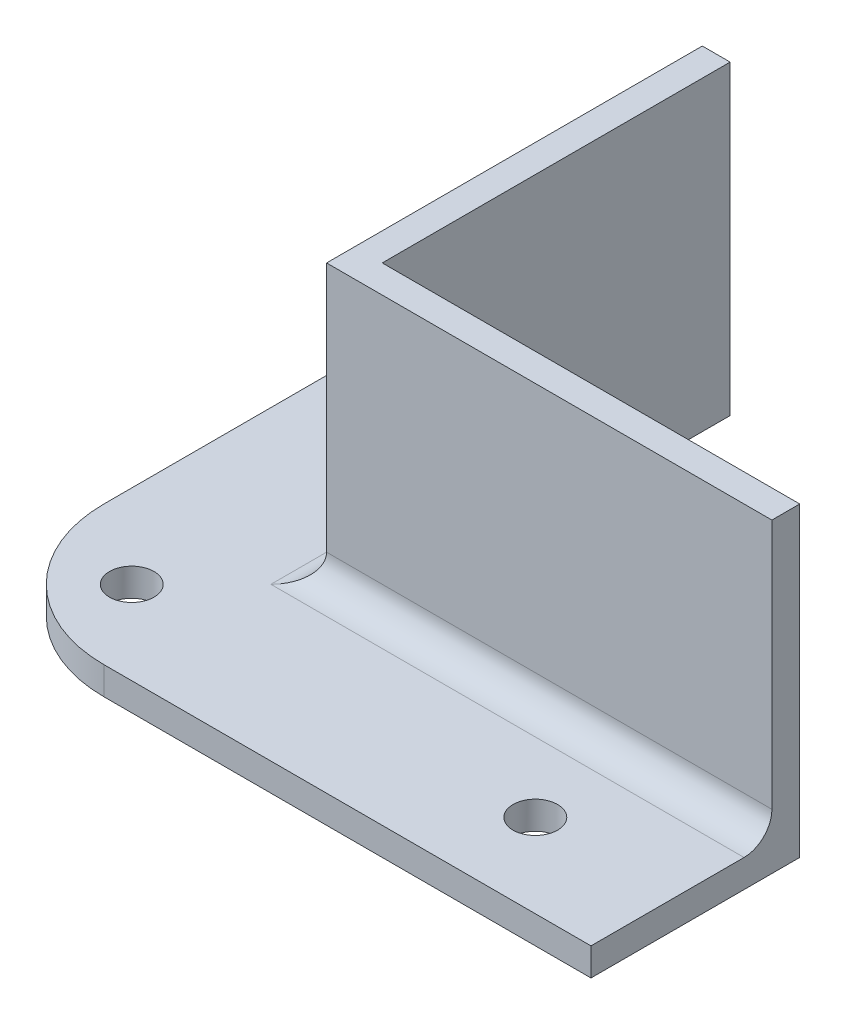
ISO-10303-21;
HEADER;
FILE_DESCRIPTION(('STEP AP214'),'2;1');
FILE_NAME('part.step','',(''),(''),'','','');
FILE_SCHEMA(('AUTOMOTIVE_DESIGN { 1 0 10303 214 1 1 1 1 }'));
ENDSEC;
DATA;
#1=APPLICATION_CONTEXT('core data for automotive mechanical design processes');
#2=APPLICATION_PROTOCOL_DEFINITION('international standard','automotive_design',2000,#1);
#3=PRODUCT_CONTEXT('',#1,'mechanical');
#4=PRODUCT('Part','Part','',(#3));
#5=PRODUCT_RELATED_PRODUCT_CATEGORY('part','',(#4));
#6=PRODUCT_DEFINITION_FORMATION('','',#4);
#7=PRODUCT_DEFINITION_CONTEXT('part definition',#1,'design');
#8=PRODUCT_DEFINITION('design','',#6,#7);
#9=PRODUCT_DEFINITION_SHAPE('','',#8);
#10=(LENGTH_UNIT() NAMED_UNIT(*) SI_UNIT(.MILLI.,.METRE.));
#11=(NAMED_UNIT(*) PLANE_ANGLE_UNIT() SI_UNIT($,.RADIAN.));
#12=(NAMED_UNIT(*) SI_UNIT($,.STERADIAN.) SOLID_ANGLE_UNIT());
#13=UNCERTAINTY_MEASURE_WITH_UNIT(LENGTH_MEASURE(1.E-05),#10,'distance_accuracy_value','');
#14=(GEOMETRIC_REPRESENTATION_CONTEXT(3) GLOBAL_UNCERTAINTY_ASSIGNED_CONTEXT((#13)) GLOBAL_UNIT_ASSIGNED_CONTEXT((#10,
#11,#12)) REPRESENTATION_CONTEXT('',''));
#15=CARTESIAN_POINT('',(0.,0.,0.));
#16=DIRECTION('',(0.,0.,1.));
#17=DIRECTION('',(1.,0.,0.));
#18=AXIS2_PLACEMENT_3D('',#15,#16,#17);
#19=CARTESIAN_POINT('',(0.,2.,0.));
#20=DIRECTION('',(0.,-1.,0.));
#21=DIRECTION('',(0.,0.,-1.));
#22=AXIS2_PLACEMENT_3D('',#19,#20,#21);
#23=PLANE('',#22);
#24=CARTESIAN_POINT('',(-17.9292929292929,2.,-15.));
#25=DIRECTION('',(0.,1.,0.));
#26=DIRECTION('',(0.,0.,1.));
#27=AXIS2_PLACEMENT_3D('',#24,#25,#26);
#28=CIRCLE('',#27,1.6);
#29=CARTESIAN_POINT('',(-17.9292929292929,2.,-13.4));
#30=VERTEX_POINT('',#29);
#31=EDGE_CURVE('E261',#30,#30,#28,.T.);
#32=ORIENTED_EDGE('',*,*,#31,.F.);
#33=EDGE_LOOP('',(#32));
#34=FACE_BOUND('',#33,.T.);
#35=CARTESIAN_POINT('',(11.0707070707071,2.,9.));
#36=DIRECTION('',(0.,1.,0.));
#37=DIRECTION('',(0.,0.,1.));
#38=AXIS2_PLACEMENT_3D('',#35,#36,#37);
#39=CIRCLE('',#38,1.6);
#40=CARTESIAN_POINT('',(11.0707070707071,2.,10.6));
#41=VERTEX_POINT('',#40);
#42=EDGE_CURVE('E468',#41,#41,#39,.T.);
#43=ORIENTED_EDGE('',*,*,#42,.F.);
#44=EDGE_LOOP('',(#43));
#45=FACE_BOUND('',#44,.T.);
#46=CARTESIAN_POINT('',(-17.9292929292929,2.,9.));
#47=DIRECTION('',(0.,1.,0.));
#48=DIRECTION('',(0.,0.,1.));
#49=AXIS2_PLACEMENT_3D('',#46,#47,#48);
#50=CIRCLE('',#49,1.6);
#51=CARTESIAN_POINT('',(-17.9292929292929,2.,10.6));
#52=VERTEX_POINT('',#51);
#53=EDGE_CURVE('E164',#52,#52,#50,.T.);
#54=ORIENTED_EDGE('',*,*,#53,.F.);
#55=EDGE_LOOP('',(#54));
#56=FACE_BOUND('',#55,.T.);
#57=DIRECTION('',(0.,0.,1.));
#58=VECTOR('',#57,1.);
#59=CARTESIAN_POINT('',(-23.9292929292929,2.,15.));
#60=LINE('',#59,#58);
#61=CARTESIAN_POINT('',(-23.9292929292929,2.,-25.));
#62=VERTEX_POINT('',#61);
#63=CARTESIAN_POINT('',(-23.9292929292929,2.,5.00000000000001));
#64=VERTEX_POINT('',#63);
#65=EDGE_CURVE('E188',#62,#64,#60,.T.);
#66=ORIENTED_EDGE('',*,*,#65,.T.);
#67=CARTESIAN_POINT('',(-13.9292929292929,2.,5.00000000000001));
#68=DIRECTION('',(0.,-1.,0.));
#69=DIRECTION('',(0.,0.,-1.));
#70=AXIS2_PLACEMENT_3D('',#67,#68,#69);
#71=CIRCLE('',#70,10.);
#72=CARTESIAN_POINT('',(-13.9292929292929,2.,15.));
#73=VERTEX_POINT('',#72);
#74=EDGE_CURVE('E11',#64,#73,#71,.F.);
#75=ORIENTED_EDGE('',*,*,#74,.T.);
#76=DIRECTION('',(1.,0.,0.));
#77=VECTOR('',#76,1.);
#78=CARTESIAN_POINT('',(21.0707070707071,2.,15.));
#79=LINE('',#78,#77);
#80=CARTESIAN_POINT('',(21.0707070707071,2.,15.));
#81=VERTEX_POINT('',#80);
#82=EDGE_CURVE('E191',#73,#81,#79,.T.);
#83=ORIENTED_EDGE('',*,*,#82,.T.);
#84=DIRECTION('',(0.,0.,-1.));
#85=VECTOR('',#84,1.);
#86=CARTESIAN_POINT('',(21.0707070707071,2.,0.));
#87=LINE('',#86,#85);
#88=CARTESIAN_POINT('',(21.0707070707071,2.,4.));
#89=VERTEX_POINT('',#88);
#90=EDGE_CURVE('E195',#81,#89,#87,.T.);
#91=ORIENTED_EDGE('',*,*,#90,.T.);
#92=DIRECTION('',(1.,0.,0.));
#93=VECTOR('',#92,1.);
#94=CARTESIAN_POINT('',(-10.9292929292929,2.,4.));
#95=LINE('',#94,#93);
#96=CARTESIAN_POINT('',(-12.9292929292929,2.,4.));
#97=VERTEX_POINT('',#96);
#98=EDGE_CURVE('E237',#89,#97,#95,.F.);
#99=ORIENTED_EDGE('',*,*,#98,.T.);
#100=DIRECTION('',(0.,0.,1.));
#101=VECTOR('',#100,1.);
#102=CARTESIAN_POINT('',(-12.9292929292929,2.,-25.));
#103=LINE('',#102,#101);
#104=CARTESIAN_POINT('',(-12.9292929292929,2.,-25.));
#105=VERTEX_POINT('',#104);
#106=EDGE_CURVE('E234',#97,#105,#103,.F.);
#107=ORIENTED_EDGE('',*,*,#106,.T.);
#108=DIRECTION('',(-1.,0.,0.));
#109=VECTOR('',#108,1.);
#110=CARTESIAN_POINT('',(-23.9292929292929,2.,-25.));
#111=LINE('',#110,#109);
#112=EDGE_CURVE('E199',#105,#62,#111,.T.);
#113=ORIENTED_EDGE('',*,*,#112,.T.);
#114=EDGE_LOOP('',(#66,#75,#83,#91,#99,#107,#113));
#115=FACE_BOUND('',#114,.T.);
#116=ADVANCED_FACE('F39',(#34,#45,#56,#115),#23,.F.);
#117=CARTESIAN_POINT('',(-23.9292929292929,2.,15.));
#118=DIRECTION('',(1.,0.,0.));
#119=DIRECTION('',(0.,0.,-1.));
#120=AXIS2_PLACEMENT_3D('',#117,#118,#119);
#121=PLANE('',#120);
#122=DIRECTION('',(0.,0.,1.));
#123=VECTOR('',#122,1.);
#124=CARTESIAN_POINT('',(-23.9292929292929,0.,15.));
#125=LINE('',#124,#123);
#126=CARTESIAN_POINT('',(-23.9292929292929,0.,-25.));
#127=VERTEX_POINT('',#126);
#128=CARTESIAN_POINT('',(-23.9292929292929,0.,5.00000000000001));
#129=VERTEX_POINT('',#128);
#130=EDGE_CURVE('E187',#127,#129,#125,.T.);
#131=ORIENTED_EDGE('',*,*,#130,.T.);
#132=DIRECTION('',(0.,-1.,0.));
#133=VECTOR('',#132,1.);
#134=CARTESIAN_POINT('',(-23.9292929292929,2.,5.00000000000001));
#135=LINE('',#134,#133);
#136=EDGE_CURVE('E49',#129,#64,#135,.F.);
#137=ORIENTED_EDGE('',*,*,#136,.T.);
#138=ORIENTED_EDGE('',*,*,#65,.F.);
#139=DIRECTION('',(0.,-1.,0.));
#140=VECTOR('',#139,1.);
#141=CARTESIAN_POINT('',(-23.9292929292929,2.,-25.));
#142=LINE('',#141,#140);
#143=EDGE_CURVE('E140',#62,#127,#142,.T.);
#144=ORIENTED_EDGE('',*,*,#143,.T.);
#145=EDGE_LOOP('',(#131,#137,#138,#144));
#146=FACE_BOUND('',#145,.T.);
#147=ADVANCED_FACE('F303',(#146),#121,.F.);
#148=CARTESIAN_POINT('',(21.0707070707071,2.,15.));
#149=DIRECTION('',(0.,0.,-1.));
#150=DIRECTION('',(-1.,0.,0.));
#151=AXIS2_PLACEMENT_3D('',#148,#149,#150);
#152=PLANE('',#151);
#153=ORIENTED_EDGE('',*,*,#82,.F.);
#154=DIRECTION('',(0.,-1.,0.));
#155=VECTOR('',#154,1.);
#156=CARTESIAN_POINT('',(-13.9292929292929,2.,15.));
#157=LINE('',#156,#155);
#158=CARTESIAN_POINT('',(-13.9292929292929,0.,15.));
#159=VERTEX_POINT('',#158);
#160=EDGE_CURVE('E248',#73,#159,#157,.T.);
#161=ORIENTED_EDGE('',*,*,#160,.T.);
#162=DIRECTION('',(1.,0.,0.));
#163=VECTOR('',#162,1.);
#164=CARTESIAN_POINT('',(21.0707070707071,0.,15.));
#165=LINE('',#164,#163);
#166=CARTESIAN_POINT('',(21.0707070707071,0.,15.));
#167=VERTEX_POINT('',#166);
#168=EDGE_CURVE('E204',#159,#167,#165,.T.);
#169=ORIENTED_EDGE('',*,*,#168,.T.);
#170=DIRECTION('',(0.,-1.,0.));
#171=VECTOR('',#170,1.);
#172=CARTESIAN_POINT('',(21.0707070707071,2.,15.));
#173=LINE('',#172,#171);
#174=EDGE_CURVE('E226',#81,#167,#173,.T.);
#175=ORIENTED_EDGE('',*,*,#174,.F.);
#176=EDGE_LOOP('',(#153,#161,#169,#175));
#177=FACE_BOUND('',#176,.T.);
#178=ADVANCED_FACE('F285',(#177),#152,.F.);
#179=CARTESIAN_POINT('',(21.0707070707071,2.,0.));
#180=DIRECTION('',(-1.,0.,0.));
#181=DIRECTION('',(0.,0.,1.));
#182=AXIS2_PLACEMENT_3D('',#179,#180,#181);
#183=PLANE('',#182);
#184=DIRECTION('',(0.,0.,-1.));
#185=VECTOR('',#184,1.);
#186=CARTESIAN_POINT('',(21.0707070707071,0.,0.));
#187=LINE('',#186,#185);
#188=CARTESIAN_POINT('',(21.0707070707071,0.,0.));
#189=VERTEX_POINT('',#188);
#190=EDGE_CURVE('E207',#167,#189,#187,.T.);
#191=ORIENTED_EDGE('',*,*,#190,.T.);
#192=DIRECTION('',(0.,-1.,0.));
#193=VECTOR('',#192,1.);
#194=CARTESIAN_POINT('',(21.0707070707071,2.,0.));
#195=LINE('',#194,#193);
#196=CARTESIAN_POINT('',(21.0707070707071,22.,0.));
#197=VERTEX_POINT('',#196);
#198=EDGE_CURVE('E222',#197,#189,#195,.T.);
#199=ORIENTED_EDGE('',*,*,#198,.F.);
#200=DIRECTION('',(0.,0.,-1.));
#201=VECTOR('',#200,1.);
#202=CARTESIAN_POINT('',(21.0707070707071,22.,2.));
#203=LINE('',#202,#201);
#204=CARTESIAN_POINT('',(21.0707070707071,22.,2.));
#205=VERTEX_POINT('',#204);
#206=EDGE_CURVE('E172',#205,#197,#203,.T.);
#207=ORIENTED_EDGE('',*,*,#206,.F.);
#208=DIRECTION('',(0.,-1.,0.));
#209=VECTOR('',#208,1.);
#210=CARTESIAN_POINT('',(21.0707070707071,22.,2.));
#211=LINE('',#210,#209);
#212=CARTESIAN_POINT('',(21.0707070707071,4.,2.));
#213=VERTEX_POINT('',#212);
#214=EDGE_CURVE('E177',#205,#213,#211,.T.);
#215=ORIENTED_EDGE('',*,*,#214,.T.);
#216=CARTESIAN_POINT('',(21.0707070707071,4.,4.));
#217=DIRECTION('',(-1.,0.,0.));
#218=DIRECTION('',(0.,0.,1.));
#219=AXIS2_PLACEMENT_3D('',#216,#217,#218);
#220=CIRCLE('',#219,2.);
#221=EDGE_CURVE('E243',#213,#89,#220,.T.);
#222=ORIENTED_EDGE('',*,*,#221,.T.);
#223=ORIENTED_EDGE('',*,*,#90,.F.);
#224=ORIENTED_EDGE('',*,*,#174,.T.);
#225=EDGE_LOOP('',(#191,#199,#207,#215,#222,#223,#224));
#226=FACE_BOUND('',#225,.T.);
#227=ADVANCED_FACE('F289',(#226),#183,.F.);
#228=CARTESIAN_POINT('',(-8.92929292929294,2.,0.));
#229=DIRECTION('',(0.,0.,1.));
#230=DIRECTION('',(1.,0.,0.));
#231=AXIS2_PLACEMENT_3D('',#228,#229,#230);
#232=PLANE('',#231);
#233=DIRECTION('',(-1.,0.,0.));
#234=VECTOR('',#233,1.);
#235=CARTESIAN_POINT('',(-8.92929292929294,0.,0.));
#236=LINE('',#235,#234);
#237=CARTESIAN_POINT('',(-8.92929292929294,0.,0.));
#238=VERTEX_POINT('',#237);
#239=EDGE_CURVE('E210',#189,#238,#236,.T.);
#240=ORIENTED_EDGE('',*,*,#239,.T.);
#241=DIRECTION('',(0.,-1.,0.));
#242=VECTOR('',#241,1.);
#243=CARTESIAN_POINT('',(-8.92929292929294,2.,0.));
#244=LINE('',#243,#242);
#245=CARTESIAN_POINT('',(-8.92929292929294,22.,0.));
#246=VERTEX_POINT('',#245);
#247=EDGE_CURVE('E139',#246,#238,#244,.T.);
#248=ORIENTED_EDGE('',*,*,#247,.F.);
#249=DIRECTION('',(-1.,0.,0.));
#250=VECTOR('',#249,1.);
#251=CARTESIAN_POINT('',(21.0707070707071,22.,0.));
#252=LINE('',#251,#250);
#253=EDGE_CURVE('E156',#197,#246,#252,.T.);
#254=ORIENTED_EDGE('',*,*,#253,.F.);
#255=ORIENTED_EDGE('',*,*,#198,.T.);
#256=EDGE_LOOP('',(#240,#248,#254,#255));
#257=FACE_BOUND('',#256,.T.);
#258=ADVANCED_FACE('F332',(#257),#232,.F.);
#259=CARTESIAN_POINT('',(-8.92929292929294,2.,-25.));
#260=DIRECTION('',(-1.,0.,0.));
#261=DIRECTION('',(0.,0.,1.));
#262=AXIS2_PLACEMENT_3D('',#259,#260,#261);
#263=PLANE('',#262);
#264=DIRECTION('',(0.,0.,-1.));
#265=VECTOR('',#264,1.);
#266=CARTESIAN_POINT('',(-8.92929292929294,0.,-25.));
#267=LINE('',#266,#265);
#268=CARTESIAN_POINT('',(-8.92929292929294,0.,-25.));
#269=VERTEX_POINT('',#268);
#270=EDGE_CURVE('E135',#238,#269,#267,.T.);
#271=ORIENTED_EDGE('',*,*,#270,.T.);
#272=DIRECTION('',(0.,-1.,0.));
#273=VECTOR('',#272,1.);
#274=CARTESIAN_POINT('',(-8.92929292929294,2.,-25.));
#275=LINE('',#274,#273);
#276=CARTESIAN_POINT('',(-8.92929292929294,22.,-25.));
#277=VERTEX_POINT('',#276);
#278=EDGE_CURVE('E128',#277,#269,#275,.T.);
#279=ORIENTED_EDGE('',*,*,#278,.F.);
#280=DIRECTION('',(0.,0.,-1.));
#281=VECTOR('',#280,1.);
#282=CARTESIAN_POINT('',(-8.92929292929294,22.,0.));
#283=LINE('',#282,#281);
#284=EDGE_CURVE('E133',#246,#277,#283,.T.);
#285=ORIENTED_EDGE('',*,*,#284,.F.);
#286=ORIENTED_EDGE('',*,*,#247,.T.);
#287=EDGE_LOOP('',(#271,#279,#285,#286));
#288=FACE_BOUND('',#287,.T.);
#289=ADVANCED_FACE('F130',(#288),#263,.F.);
#290=CARTESIAN_POINT('',(-23.9292929292929,2.,-25.));
#291=DIRECTION('',(0.,0.,1.));
#292=DIRECTION('',(1.,0.,0.));
#293=AXIS2_PLACEMENT_3D('',#290,#291,#292);
#294=PLANE('',#293);
#295=DIRECTION('',(-1.,0.,0.));
#296=VECTOR('',#295,1.);
#297=CARTESIAN_POINT('',(-23.9292929292929,0.,-25.));
#298=LINE('',#297,#296);
#299=EDGE_CURVE('E192',#269,#127,#298,.T.);
#300=ORIENTED_EDGE('',*,*,#299,.T.);
#301=ORIENTED_EDGE('',*,*,#143,.F.);
#302=ORIENTED_EDGE('',*,*,#112,.F.);
#303=CARTESIAN_POINT('',(-12.9292929292929,4.,-25.));
#304=DIRECTION('',(0.,0.,1.));
#305=DIRECTION('',(1.,0.,0.));
#306=AXIS2_PLACEMENT_3D('',#303,#304,#305);
#307=CIRCLE('',#306,2.);
#308=CARTESIAN_POINT('',(-10.9292929292929,4.,-25.));
#309=VERTEX_POINT('',#308);
#310=EDGE_CURVE('E246',#105,#309,#307,.T.);
#311=ORIENTED_EDGE('',*,*,#310,.T.);
#312=DIRECTION('',(0.,-1.,0.));
#313=VECTOR('',#312,1.);
#314=CARTESIAN_POINT('',(-10.9292929292929,22.,-25.));
#315=LINE('',#314,#313);
#316=CARTESIAN_POINT('',(-10.9292929292929,22.,-25.));
#317=VERTEX_POINT('',#316);
#318=EDGE_CURVE('E146',#317,#309,#315,.T.);
#319=ORIENTED_EDGE('',*,*,#318,.F.);
#320=DIRECTION('',(-1.,0.,0.));
#321=VECTOR('',#320,1.);
#322=CARTESIAN_POINT('',(-8.92929292929294,22.,-25.));
#323=LINE('',#322,#321);
#324=EDGE_CURVE('E143',#277,#317,#323,.T.);
#325=ORIENTED_EDGE('',*,*,#324,.F.);
#326=ORIENTED_EDGE('',*,*,#278,.T.);
#327=EDGE_LOOP('',(#300,#301,#302,#311,#319,#325,#326));
#328=FACE_BOUND('',#327,.T.);
#329=ADVANCED_FACE('F144',(#328),#294,.F.);
#330=CARTESIAN_POINT('',(0.,0.,0.));
#331=DIRECTION('',(0.,-1.,0.));
#332=DIRECTION('',(0.,0.,-1.));
#333=AXIS2_PLACEMENT_3D('',#330,#331,#332);
#334=PLANE('',#333);
#335=CARTESIAN_POINT('',(-17.9292929292929,0.,-15.));
#336=DIRECTION('',(0.,-1.,0.));
#337=DIRECTION('',(0.,0.,-1.));
#338=AXIS2_PLACEMENT_3D('',#335,#336,#337);
#339=CIRCLE('',#338,1.6);
#340=CARTESIAN_POINT('',(-17.9292929292929,0.,-16.6));
#341=VERTEX_POINT('',#340);
#342=EDGE_CURVE('E43',#341,#341,#339,.T.);
#343=ORIENTED_EDGE('',*,*,#342,.F.);
#344=EDGE_LOOP('',(#343));
#345=FACE_BOUND('',#344,.T.);
#346=CARTESIAN_POINT('',(11.0707070707071,0.,9.));
#347=DIRECTION('',(0.,-1.,0.));
#348=DIRECTION('',(0.,0.,-1.));
#349=AXIS2_PLACEMENT_3D('',#346,#347,#348);
#350=CIRCLE('',#349,1.6);
#351=CARTESIAN_POINT('',(11.0707070707071,0.,7.4));
#352=VERTEX_POINT('',#351);
#353=EDGE_CURVE('E260',#352,#352,#350,.T.);
#354=ORIENTED_EDGE('',*,*,#353,.F.);
#355=EDGE_LOOP('',(#354));
#356=FACE_BOUND('',#355,.T.);
#357=CARTESIAN_POINT('',(-17.9292929292929,0.,9.));
#358=DIRECTION('',(0.,-1.,0.));
#359=DIRECTION('',(0.,0.,-1.));
#360=AXIS2_PLACEMENT_3D('',#357,#358,#359);
#361=CIRCLE('',#360,1.6);
#362=CARTESIAN_POINT('',(-17.9292929292929,0.,7.4));
#363=VERTEX_POINT('',#362);
#364=EDGE_CURVE('E257',#363,#363,#361,.T.);
#365=ORIENTED_EDGE('',*,*,#364,.F.);
#366=EDGE_LOOP('',(#365));
#367=FACE_BOUND('',#366,.T.);
#368=ORIENTED_EDGE('',*,*,#168,.F.);
#369=CARTESIAN_POINT('',(-13.9292929292929,0.,5.00000000000001));
#370=DIRECTION('',(0.,-1.,0.));
#371=DIRECTION('',(0.,0.,-1.));
#372=AXIS2_PLACEMENT_3D('',#369,#370,#371);
#373=CIRCLE('',#372,10.);
#374=EDGE_CURVE('E64',#159,#129,#373,.T.);
#375=ORIENTED_EDGE('',*,*,#374,.T.);
#376=ORIENTED_EDGE('',*,*,#130,.F.);
#377=ORIENTED_EDGE('',*,*,#299,.F.);
#378=ORIENTED_EDGE('',*,*,#270,.F.);
#379=ORIENTED_EDGE('',*,*,#239,.F.);
#380=ORIENTED_EDGE('',*,*,#190,.F.);
#381=EDGE_LOOP('',(#368,#375,#376,#377,#378,#379,#380));
#382=FACE_BOUND('',#381,.T.);
#383=ADVANCED_FACE('F273',(#345,#356,#367,#382),#334,.T.);
#384=CARTESIAN_POINT('',(-10.9292929292929,22.,-25.));
#385=DIRECTION('',(1.,0.,0.));
#386=DIRECTION('',(0.,0.,-1.));
#387=AXIS2_PLACEMENT_3D('',#384,#385,#386);
#388=PLANE('',#387);
#389=ORIENTED_EDGE('',*,*,#318,.T.);
#390=DIRECTION('',(0.,0.,1.));
#391=VECTOR('',#390,1.);
#392=CARTESIAN_POINT('',(-10.9292929292929,4.,2.));
#393=LINE('',#392,#391);
#394=CARTESIAN_POINT('',(-10.9292929292929,4.,2.));
#395=VERTEX_POINT('',#394);
#396=EDGE_CURVE('E240',#309,#395,#393,.T.);
#397=ORIENTED_EDGE('',*,*,#396,.T.);
#398=DIRECTION('',(0.,-1.,0.));
#399=VECTOR('',#398,1.);
#400=CARTESIAN_POINT('',(-10.9292929292929,22.,2.));
#401=LINE('',#400,#399);
#402=CARTESIAN_POINT('',(-10.9292929292929,22.,2.));
#403=VERTEX_POINT('',#402);
#404=EDGE_CURVE('E181',#403,#395,#401,.T.);
#405=ORIENTED_EDGE('',*,*,#404,.F.);
#406=DIRECTION('',(0.,0.,1.));
#407=VECTOR('',#406,1.);
#408=CARTESIAN_POINT('',(-10.9292929292929,22.,-25.));
#409=LINE('',#408,#407);
#410=EDGE_CURVE('E150',#317,#403,#409,.T.);
#411=ORIENTED_EDGE('',*,*,#410,.F.);
#412=EDGE_LOOP('',(#389,#397,#405,#411));
#413=FACE_BOUND('',#412,.T.);
#414=ADVANCED_FACE('F276',(#413),#388,.F.);
#415=CARTESIAN_POINT('',(-10.9292929292929,22.,2.));
#416=DIRECTION('',(0.,0.,-1.));
#417=DIRECTION('',(-1.,0.,0.));
#418=AXIS2_PLACEMENT_3D('',#415,#416,#417);
#419=PLANE('',#418);
#420=ORIENTED_EDGE('',*,*,#404,.T.);
#421=DIRECTION('',(1.,0.,0.));
#422=VECTOR('',#421,1.);
#423=CARTESIAN_POINT('',(21.0707070707071,4.,2.));
#424=LINE('',#423,#422);
#425=EDGE_CURVE('E230',#395,#213,#424,.T.);
#426=ORIENTED_EDGE('',*,*,#425,.T.);
#427=ORIENTED_EDGE('',*,*,#214,.F.);
#428=DIRECTION('',(1.,0.,0.));
#429=VECTOR('',#428,1.);
#430=CARTESIAN_POINT('',(-10.9292929292929,22.,2.));
#431=LINE('',#430,#429);
#432=EDGE_CURVE('E169',#403,#205,#431,.T.);
#433=ORIENTED_EDGE('',*,*,#432,.F.);
#434=EDGE_LOOP('',(#420,#426,#427,#433));
#435=FACE_BOUND('',#434,.T.);
#436=ADVANCED_FACE('F343',(#435),#419,.F.);
#437=CARTESIAN_POINT('',(0.,22.,0.));
#438=DIRECTION('',(0.,1.,0.));
#439=DIRECTION('',(0.,0.,1.));
#440=AXIS2_PLACEMENT_3D('',#437,#438,#439);
#441=PLANE('',#440);
#442=ORIENTED_EDGE('',*,*,#284,.T.);
#443=ORIENTED_EDGE('',*,*,#324,.T.);
#444=ORIENTED_EDGE('',*,*,#410,.T.);
#445=ORIENTED_EDGE('',*,*,#432,.T.);
#446=ORIENTED_EDGE('',*,*,#206,.T.);
#447=ORIENTED_EDGE('',*,*,#253,.T.);
#448=EDGE_LOOP('',(#442,#443,#444,#445,#446,#447));
#449=FACE_BOUND('',#448,.T.);
#450=ADVANCED_FACE('F153',(#449),#441,.T.);
#451=CARTESIAN_POINT('',(-12.9292929292929,4.,-25.));
#452=DIRECTION('',(0.,0.,-1.));
#453=DIRECTION('',(-1.,0.,0.));
#454=AXIS2_PLACEMENT_3D('',#451,#452,#453);
#455=CYLINDRICAL_SURFACE('',#454,2.);
#456=ORIENTED_EDGE('',*,*,#310,.F.);
#457=ORIENTED_EDGE('',*,*,#106,.F.);
#458=CARTESIAN_POINT('',(-12.9292929292929,4.,4.));
#459=DIRECTION('',(-0.707106781186548,0.,-0.707106781186547));
#460=DIRECTION('',(0.707106781186547,0.,-0.707106781186548));
#461=AXIS2_PLACEMENT_3D('',#458,#459,#460);
#462=ELLIPSE('',#461,2.82842712474619,2.);
#463=EDGE_CURVE('E158',#395,#97,#462,.T.);
#464=ORIENTED_EDGE('',*,*,#463,.F.);
#465=ORIENTED_EDGE('',*,*,#396,.F.);
#466=EDGE_LOOP('',(#456,#457,#464,#465));
#467=FACE_BOUND('',#466,.T.);
#468=ADVANCED_FACE('F300',(#467),#455,.F.);
#469=CARTESIAN_POINT('',(-10.9292929292929,4.,4.));
#470=DIRECTION('',(-1.,0.,0.));
#471=DIRECTION('',(0.,0.,1.));
#472=AXIS2_PLACEMENT_3D('',#469,#470,#471);
#473=CYLINDRICAL_SURFACE('',#472,2.);
#474=ORIENTED_EDGE('',*,*,#463,.T.);
#475=ORIENTED_EDGE('',*,*,#98,.F.);
#476=ORIENTED_EDGE('',*,*,#221,.F.);
#477=ORIENTED_EDGE('',*,*,#425,.F.);
#478=EDGE_LOOP('',(#474,#475,#476,#477));
#479=FACE_BOUND('',#478,.T.);
#480=ADVANCED_FACE('F294',(#479),#473,.F.);
#481=CARTESIAN_POINT('',(-13.9292929292929,2.,5.00000000000001));
#482=DIRECTION('',(0.,-1.,0.));
#483=DIRECTION('',(0.,0.,-1.));
#484=AXIS2_PLACEMENT_3D('',#481,#482,#483);
#485=CYLINDRICAL_SURFACE('',#484,10.);
#486=ORIENTED_EDGE('',*,*,#74,.F.);
#487=ORIENTED_EDGE('',*,*,#136,.F.);
#488=ORIENTED_EDGE('',*,*,#374,.F.);
#489=ORIENTED_EDGE('',*,*,#160,.F.);
#490=EDGE_LOOP('',(#486,#487,#488,#489));
#491=FACE_BOUND('',#490,.T.);
#492=ADVANCED_FACE('F41',(#491),#485,.T.);
#493=CARTESIAN_POINT('',(-17.9292929292929,-18.,9.));
#494=DIRECTION('',(0.,1.,0.));
#495=DIRECTION('',(0.,0.,1.));
#496=AXIS2_PLACEMENT_3D('',#493,#494,#495);
#497=CYLINDRICAL_SURFACE('',#496,1.6);
#498=ORIENTED_EDGE('',*,*,#364,.T.);
#499=EDGE_LOOP('',(#498));
#500=FACE_BOUND('',#499,.T.);
#501=ORIENTED_EDGE('',*,*,#53,.T.);
#502=EDGE_LOOP('',(#501));
#503=FACE_BOUND('',#502,.T.);
#504=ADVANCED_FACE('F307',(#500,#503),#497,.F.);
#505=CARTESIAN_POINT('',(11.0707070707071,-18.,9.));
#506=DIRECTION('',(0.,1.,0.));
#507=DIRECTION('',(0.,0.,1.));
#508=AXIS2_PLACEMENT_3D('',#505,#506,#507);
#509=CYLINDRICAL_SURFACE('',#508,1.6);
#510=ORIENTED_EDGE('',*,*,#353,.T.);
#511=EDGE_LOOP('',(#510));
#512=FACE_BOUND('',#511,.T.);
#513=ORIENTED_EDGE('',*,*,#42,.T.);
#514=EDGE_LOOP('',(#513));
#515=FACE_BOUND('',#514,.T.);
#516=ADVANCED_FACE('F312',(#512,#515),#509,.F.);
#517=CARTESIAN_POINT('',(-17.9292929292929,-18.,-15.));
#518=DIRECTION('',(0.,1.,0.));
#519=DIRECTION('',(0.,0.,1.));
#520=AXIS2_PLACEMENT_3D('',#517,#518,#519);
#521=CYLINDRICAL_SURFACE('',#520,1.6);
#522=ORIENTED_EDGE('',*,*,#342,.T.);
#523=EDGE_LOOP('',(#522));
#524=FACE_BOUND('',#523,.T.);
#525=ORIENTED_EDGE('',*,*,#31,.T.);
#526=EDGE_LOOP('',(#525));
#527=FACE_BOUND('',#526,.T.);
#528=ADVANCED_FACE('F270',(#524,#527),#521,.F.);
#529=CLOSED_SHELL('',(#116,#147,#178,#227,#258,#289,#329,#383,#414,#436,#450,#468,#480,#492,
#504,#516,#528));
#530=MANIFOLD_SOLID_BREP('B2',#529);
#531=ADVANCED_BREP_SHAPE_REPRESENTATION('',(#18,#530),#14);
#532=SHAPE_DEFINITION_REPRESENTATION(#9,#531);
ENDSEC;
END-ISO-10303-21;
